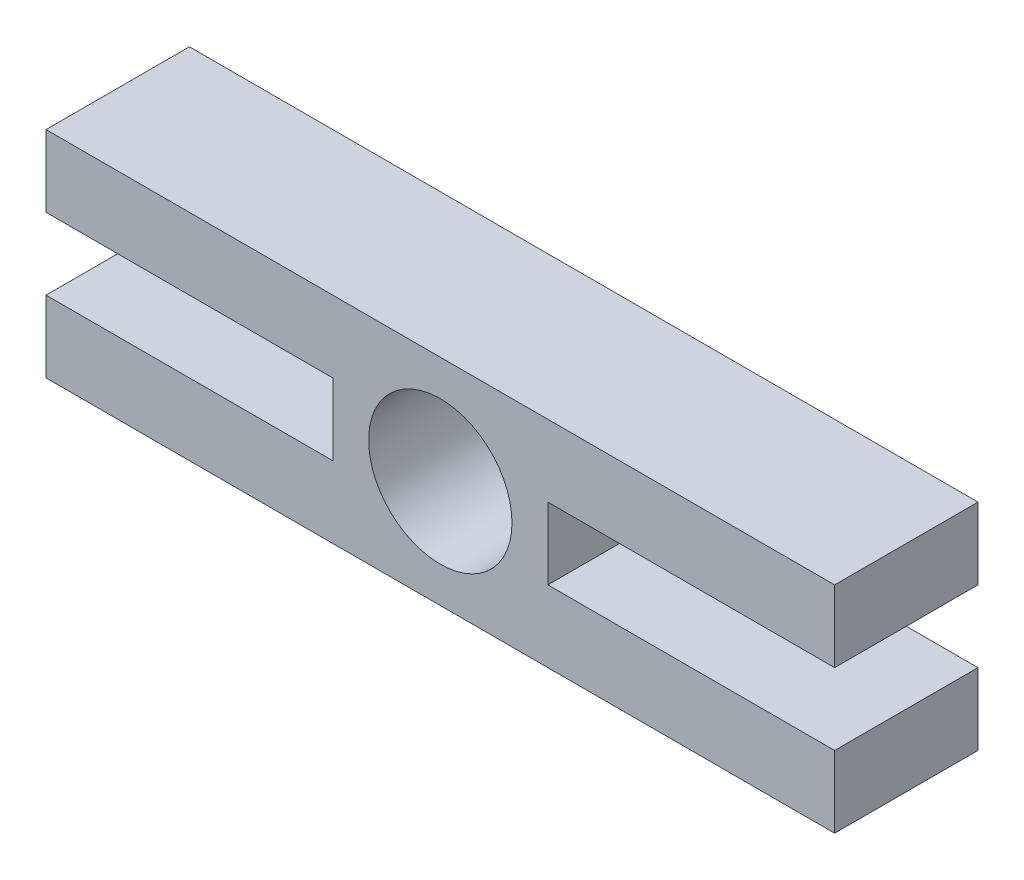
ISO-10303-21;
HEADER;
FILE_DESCRIPTION(('STEP AP214'),'2;1');
FILE_NAME('part.step','',(''),(''),'','','');
FILE_SCHEMA(('AUTOMOTIVE_DESIGN { 1 0 10303 214 1 1 1 1 }'));
ENDSEC;
DATA;
#1=APPLICATION_CONTEXT('core data for automotive mechanical design processes');
#2=APPLICATION_PROTOCOL_DEFINITION('international standard','automotive_design',2000,#1);
#3=PRODUCT_CONTEXT('',#1,'mechanical');
#4=PRODUCT('Part','Part','',(#3));
#5=PRODUCT_RELATED_PRODUCT_CATEGORY('part','',(#4));
#6=PRODUCT_DEFINITION_FORMATION('','',#4);
#7=PRODUCT_DEFINITION_CONTEXT('part definition',#1,'design');
#8=PRODUCT_DEFINITION('design','',#6,#7);
#9=PRODUCT_DEFINITION_SHAPE('','',#8);
#10=(LENGTH_UNIT() NAMED_UNIT(*) SI_UNIT(.MILLI.,.METRE.));
#11=(NAMED_UNIT(*) PLANE_ANGLE_UNIT() SI_UNIT($,.RADIAN.));
#12=(NAMED_UNIT(*) SI_UNIT($,.STERADIAN.) SOLID_ANGLE_UNIT());
#13=UNCERTAINTY_MEASURE_WITH_UNIT(LENGTH_MEASURE(1.E-05),#10,'distance_accuracy_value','');
#14=(GEOMETRIC_REPRESENTATION_CONTEXT(3) GLOBAL_UNCERTAINTY_ASSIGNED_CONTEXT((#13)) GLOBAL_UNIT_ASSIGNED_CONTEXT((#10,
#11,#12)) REPRESENTATION_CONTEXT('',''));
#15=CARTESIAN_POINT('',(0.,0.,0.));
#16=DIRECTION('',(0.,0.,1.));
#17=DIRECTION('',(1.,0.,0.));
#18=AXIS2_PLACEMENT_3D('',#15,#16,#17);
#19=CARTESIAN_POINT('',(0.,0.,25.4));
#20=DIRECTION('',(0.,0.,-1.));
#21=DIRECTION('',(-1.,0.,0.));
#22=AXIS2_PLACEMENT_3D('',#19,#20,#21);
#23=PLANE('',#22);
#24=DIRECTION('',(0.,-1.,0.));
#25=VECTOR('',#24,1.);
#26=CARTESIAN_POINT('',(-50.8,-6.34999999999994,25.4));
#27=LINE('',#26,#25);
#28=CARTESIAN_POINT('',(-50.8,6.34999999999999,25.4));
#29=VERTEX_POINT('',#28);
#30=CARTESIAN_POINT('',(-50.8,-6.34999999999994,25.4));
#31=VERTEX_POINT('',#30);
#32=EDGE_CURVE('E54',#29,#31,#27,.T.);
#33=ORIENTED_EDGE('',*,*,#32,.T.);
#34=DIRECTION('',(1.,0.,0.));
#35=VECTOR('',#34,1.);
#36=CARTESIAN_POINT('',(19.05,-6.35000000000002,25.4));
#37=LINE('',#36,#35);
#38=CARTESIAN_POINT('',(88.9,-6.35000000000009,25.4));
#39=VERTEX_POINT('',#38);
#40=EDGE_CURVE('E110',#31,#39,#37,.T.);
#41=ORIENTED_EDGE('',*,*,#40,.T.);
#42=DIRECTION('',(0.,1.,0.));
#43=VECTOR('',#42,1.);
#44=CARTESIAN_POINT('',(88.9,-6.35000000000009,25.4));
#45=LINE('',#44,#43);
#46=CARTESIAN_POINT('',(88.9,6.35000000000001,25.4));
#47=VERTEX_POINT('',#46);
#48=EDGE_CURVE('E214',#39,#47,#45,.T.);
#49=ORIENTED_EDGE('',*,*,#48,.T.);
#50=DIRECTION('',(-1.,0.,0.));
#51=VECTOR('',#50,1.);
#52=CARTESIAN_POINT('',(88.9,6.35000000000001,25.4));
#53=LINE('',#52,#51);
#54=CARTESIAN_POINT('',(38.1,6.34999999999999,25.4));
#55=VERTEX_POINT('',#54);
#56=EDGE_CURVE('E229',#47,#55,#53,.T.);
#57=ORIENTED_EDGE('',*,*,#56,.T.);
#58=DIRECTION('',(0.,1.,0.));
#59=VECTOR('',#58,1.);
#60=CARTESIAN_POINT('',(38.1,6.34999999999999,25.4));
#61=LINE('',#60,#59);
#62=CARTESIAN_POINT('',(38.1,19.05,25.4));
#63=VERTEX_POINT('',#62);
#64=EDGE_CURVE('E231',#55,#63,#61,.T.);
#65=ORIENTED_EDGE('',*,*,#64,.T.);
#66=DIRECTION('',(1.,0.,0.));
#67=VECTOR('',#66,1.);
#68=CARTESIAN_POINT('',(38.1,19.05,25.4));
#69=LINE('',#68,#67);
#70=CARTESIAN_POINT('',(88.9,19.05,25.4));
#71=VERTEX_POINT('',#70);
#72=EDGE_CURVE('E233',#63,#71,#69,.T.);
#73=ORIENTED_EDGE('',*,*,#72,.T.);
#74=DIRECTION('',(0.,1.,0.));
#75=VECTOR('',#74,1.);
#76=CARTESIAN_POINT('',(88.9,19.05,25.4));
#77=LINE('',#76,#75);
#78=CARTESIAN_POINT('',(88.9,31.75,25.4));
#79=VERTEX_POINT('',#78);
#80=EDGE_CURVE('E235',#71,#79,#77,.T.);
#81=ORIENTED_EDGE('',*,*,#80,.T.);
#82=DIRECTION('',(-1.,0.,0.));
#83=VECTOR('',#82,1.);
#84=CARTESIAN_POINT('',(19.05,31.75,25.4));
#85=LINE('',#84,#83);
#86=CARTESIAN_POINT('',(-50.8,31.75,25.4));
#87=VERTEX_POINT('',#86);
#88=EDGE_CURVE('E237',#79,#87,#85,.T.);
#89=ORIENTED_EDGE('',*,*,#88,.T.);
#90=DIRECTION('',(0.,-1.,0.));
#91=VECTOR('',#90,1.);
#92=CARTESIAN_POINT('',(-50.8,31.75,25.4));
#93=LINE('',#92,#91);
#94=CARTESIAN_POINT('',(-50.8,19.05,25.4));
#95=VERTEX_POINT('',#94);
#96=EDGE_CURVE('E142',#87,#95,#93,.T.);
#97=ORIENTED_EDGE('',*,*,#96,.T.);
#98=DIRECTION('',(1.,0.,0.));
#99=VECTOR('',#98,1.);
#100=CARTESIAN_POINT('',(0.,19.05,25.4));
#101=LINE('',#100,#99);
#102=CARTESIAN_POINT('',(0.,19.05,25.4));
#103=VERTEX_POINT('',#102);
#104=EDGE_CURVE('E136',#95,#103,#101,.T.);
#105=ORIENTED_EDGE('',*,*,#104,.T.);
#106=DIRECTION('',(0.,-1.,0.));
#107=VECTOR('',#106,1.);
#108=CARTESIAN_POINT('',(0.,6.34999999999999,25.4));
#109=LINE('',#108,#107);
#110=CARTESIAN_POINT('',(0.,6.34999999999999,25.4));
#111=VERTEX_POINT('',#110);
#112=EDGE_CURVE('E140',#103,#111,#109,.T.);
#113=ORIENTED_EDGE('',*,*,#112,.T.);
#114=DIRECTION('',(-1.,0.,0.));
#115=VECTOR('',#114,1.);
#116=CARTESIAN_POINT('',(-50.8,6.34999999999999,25.4));
#117=LINE('',#116,#115);
#118=EDGE_CURVE('E156',#111,#29,#117,.T.);
#119=ORIENTED_EDGE('',*,*,#118,.T.);
#120=EDGE_LOOP('',(#33,#41,#49,#57,#65,#73,#81,#89,#97,#105,#113,#119));
#121=FACE_BOUND('',#120,.T.);
#122=CARTESIAN_POINT('',(19.05,12.7,25.4));
#123=DIRECTION('',(0.,0.,1.));
#124=DIRECTION('',(1.,0.,0.));
#125=AXIS2_PLACEMENT_3D('',#122,#123,#124);
#126=CIRCLE('',#125,12.7);
#127=CARTESIAN_POINT('',(31.75,12.7,25.4));
#128=VERTEX_POINT('',#127);
#129=EDGE_CURVE('E166',#128,#128,#126,.T.);
#130=ORIENTED_EDGE('',*,*,#129,.F.);
#131=EDGE_LOOP('',(#130));
#132=FACE_BOUND('',#131,.T.);
#133=ADVANCED_FACE('F37',(#121,#132),#23,.F.);
#134=CARTESIAN_POINT('',(0.,0.,0.));
#135=DIRECTION('',(0.,0.,-1.));
#136=DIRECTION('',(-1.,0.,0.));
#137=AXIS2_PLACEMENT_3D('',#134,#135,#136);
#138=PLANE('',#137);
#139=DIRECTION('',(1.,0.,0.));
#140=VECTOR('',#139,1.);
#141=CARTESIAN_POINT('',(19.05,-6.35000000000002,0.));
#142=LINE('',#141,#140);
#143=CARTESIAN_POINT('',(-50.8,-6.34999999999994,0.));
#144=VERTEX_POINT('',#143);
#145=CARTESIAN_POINT('',(88.9,-6.35000000000009,0.));
#146=VERTEX_POINT('',#145);
#147=EDGE_CURVE('E162',#144,#146,#142,.T.);
#148=ORIENTED_EDGE('',*,*,#147,.F.);
#149=DIRECTION('',(0.,-1.,0.));
#150=VECTOR('',#149,1.);
#151=CARTESIAN_POINT('',(-50.8,0.,0.));
#152=LINE('',#151,#150);
#153=CARTESIAN_POINT('',(-50.8,6.34999999999999,0.));
#154=VERTEX_POINT('',#153);
#155=EDGE_CURVE('E186',#154,#144,#152,.T.);
#156=ORIENTED_EDGE('',*,*,#155,.F.);
#157=DIRECTION('',(-1.,0.,0.));
#158=VECTOR('',#157,1.);
#159=CARTESIAN_POINT('',(-50.8,6.34999999999999,0.));
#160=LINE('',#159,#158);
#161=CARTESIAN_POINT('',(0.,6.34999999999999,0.));
#162=VERTEX_POINT('',#161);
#163=EDGE_CURVE('E103',#162,#154,#160,.T.);
#164=ORIENTED_EDGE('',*,*,#163,.F.);
#165=DIRECTION('',(0.,-1.,0.));
#166=VECTOR('',#165,1.);
#167=CARTESIAN_POINT('',(0.,6.34999999999999,0.));
#168=LINE('',#167,#166);
#169=CARTESIAN_POINT('',(0.,19.05,0.));
#170=VERTEX_POINT('',#169);
#171=EDGE_CURVE('E96',#170,#162,#168,.T.);
#172=ORIENTED_EDGE('',*,*,#171,.F.);
#173=DIRECTION('',(1.,0.,0.));
#174=VECTOR('',#173,1.);
#175=CARTESIAN_POINT('',(0.,19.05,0.));
#176=LINE('',#175,#174);
#177=CARTESIAN_POINT('',(-50.8,19.05,0.));
#178=VERTEX_POINT('',#177);
#179=EDGE_CURVE('E150',#178,#170,#176,.T.);
#180=ORIENTED_EDGE('',*,*,#179,.F.);
#181=DIRECTION('',(0.,-1.,0.));
#182=VECTOR('',#181,1.);
#183=CARTESIAN_POINT('',(-50.8,19.05,0.));
#184=LINE('',#183,#182);
#185=CARTESIAN_POINT('',(-50.8,31.75,0.));
#186=VERTEX_POINT('',#185);
#187=EDGE_CURVE('E181',#186,#178,#184,.T.);
#188=ORIENTED_EDGE('',*,*,#187,.F.);
#189=DIRECTION('',(-1.,0.,0.));
#190=VECTOR('',#189,1.);
#191=CARTESIAN_POINT('',(19.05,31.75,0.));
#192=LINE('',#191,#190);
#193=CARTESIAN_POINT('',(88.9,31.75,0.));
#194=VERTEX_POINT('',#193);
#195=EDGE_CURVE('E178',#194,#186,#192,.T.);
#196=ORIENTED_EDGE('',*,*,#195,.F.);
#197=DIRECTION('',(0.,1.,0.));
#198=VECTOR('',#197,1.);
#199=CARTESIAN_POINT('',(88.9,31.75,0.));
#200=LINE('',#199,#198);
#201=CARTESIAN_POINT('',(88.9,19.05,0.));
#202=VERTEX_POINT('',#201);
#203=EDGE_CURVE('E175',#202,#194,#200,.T.);
#204=ORIENTED_EDGE('',*,*,#203,.F.);
#205=DIRECTION('',(1.,0.,0.));
#206=VECTOR('',#205,1.);
#207=CARTESIAN_POINT('',(38.1,19.05,0.));
#208=LINE('',#207,#206);
#209=CARTESIAN_POINT('',(38.1,19.05,0.));
#210=VERTEX_POINT('',#209);
#211=EDGE_CURVE('E172',#210,#202,#208,.T.);
#212=ORIENTED_EDGE('',*,*,#211,.F.);
#213=DIRECTION('',(0.,1.,0.));
#214=VECTOR('',#213,1.);
#215=CARTESIAN_POINT('',(38.1,6.34999999999999,0.));
#216=LINE('',#215,#214);
#217=CARTESIAN_POINT('',(38.1,6.34999999999999,0.));
#218=VERTEX_POINT('',#217);
#219=EDGE_CURVE('E170',#218,#210,#216,.T.);
#220=ORIENTED_EDGE('',*,*,#219,.F.);
#221=DIRECTION('',(-1.,0.,0.));
#222=VECTOR('',#221,1.);
#223=CARTESIAN_POINT('',(88.9,6.35000000000001,0.));
#224=LINE('',#223,#222);
#225=CARTESIAN_POINT('',(88.9,6.35000000000001,0.));
#226=VERTEX_POINT('',#225);
#227=EDGE_CURVE('E168',#226,#218,#224,.T.);
#228=ORIENTED_EDGE('',*,*,#227,.F.);
#229=DIRECTION('',(0.,1.,0.));
#230=VECTOR('',#229,1.);
#231=CARTESIAN_POINT('',(88.9,0.,0.));
#232=LINE('',#231,#230);
#233=EDGE_CURVE('E165',#146,#226,#232,.T.);
#234=ORIENTED_EDGE('',*,*,#233,.F.);
#235=EDGE_LOOP('',(#148,#156,#164,#172,#180,#188,#196,#204,#212,#220,#228,#234));
#236=FACE_BOUND('',#235,.T.);
#237=CARTESIAN_POINT('',(19.05,12.7,0.));
#238=DIRECTION('',(0.,0.,1.));
#239=DIRECTION('',(1.,0.,0.));
#240=AXIS2_PLACEMENT_3D('',#237,#238,#239);
#241=CIRCLE('',#240,12.7);
#242=CARTESIAN_POINT('',(31.75,12.7,0.));
#243=VERTEX_POINT('',#242);
#244=EDGE_CURVE('E225',#243,#243,#241,.T.);
#245=ORIENTED_EDGE('',*,*,#244,.T.);
#246=EDGE_LOOP('',(#245));
#247=FACE_BOUND('',#246,.T.);
#248=ADVANCED_FACE('F217',(#236,#247),#138,.T.);
#249=CARTESIAN_POINT('',(19.05,-6.35000000000002,25.4));
#250=DIRECTION('',(0.,1.,0.));
#251=DIRECTION('',(-1.,0.,0.));
#252=AXIS2_PLACEMENT_3D('',#249,#250,#251);
#253=PLANE('',#252);
#254=ORIENTED_EDGE('',*,*,#147,.T.);
#255=DIRECTION('',(0.,0.,-1.));
#256=VECTOR('',#255,1.);
#257=CARTESIAN_POINT('',(88.9,-6.35000000000009,25.4));
#258=LINE('',#257,#256);
#259=EDGE_CURVE('E46',#39,#146,#258,.T.);
#260=ORIENTED_EDGE('',*,*,#259,.F.);
#261=ORIENTED_EDGE('',*,*,#40,.F.);
#262=DIRECTION('',(0.,0.,-1.));
#263=VECTOR('',#262,1.);
#264=CARTESIAN_POINT('',(-50.8,-6.34999999999994,25.4));
#265=LINE('',#264,#263);
#266=EDGE_CURVE('E11',#31,#144,#265,.T.);
#267=ORIENTED_EDGE('',*,*,#266,.T.);
#268=EDGE_LOOP('',(#254,#260,#261,#267));
#269=FACE_BOUND('',#268,.T.);
#270=ADVANCED_FACE('F39',(#269),#253,.F.);
#271=CARTESIAN_POINT('',(88.9,0.,25.4));
#272=DIRECTION('',(-1.,0.,0.));
#273=DIRECTION('',(0.,0.,1.));
#274=AXIS2_PLACEMENT_3D('',#271,#272,#273);
#275=PLANE('',#274);
#276=ORIENTED_EDGE('',*,*,#233,.T.);
#277=DIRECTION('',(0.,0.,-1.));
#278=VECTOR('',#277,1.);
#279=CARTESIAN_POINT('',(88.9,6.35000000000001,25.4));
#280=LINE('',#279,#278);
#281=EDGE_CURVE('E207',#47,#226,#280,.T.);
#282=ORIENTED_EDGE('',*,*,#281,.F.);
#283=ORIENTED_EDGE('',*,*,#48,.F.);
#284=ORIENTED_EDGE('',*,*,#259,.T.);
#285=EDGE_LOOP('',(#276,#282,#283,#284));
#286=FACE_BOUND('',#285,.T.);
#287=ADVANCED_FACE('F212',(#286),#275,.F.);
#288=CARTESIAN_POINT('',(88.9,6.35000000000001,25.4));
#289=DIRECTION('',(0.,-1.,0.));
#290=DIRECTION('',(1.,0.,0.));
#291=AXIS2_PLACEMENT_3D('',#288,#289,#290);
#292=PLANE('',#291);
#293=ORIENTED_EDGE('',*,*,#227,.T.);
#294=DIRECTION('',(0.,0.,-1.));
#295=VECTOR('',#294,1.);
#296=CARTESIAN_POINT('',(38.1,6.34999999999999,25.4));
#297=LINE('',#296,#295);
#298=EDGE_CURVE('E204',#55,#218,#297,.T.);
#299=ORIENTED_EDGE('',*,*,#298,.F.);
#300=ORIENTED_EDGE('',*,*,#56,.F.);
#301=ORIENTED_EDGE('',*,*,#281,.T.);
#302=EDGE_LOOP('',(#293,#299,#300,#301));
#303=FACE_BOUND('',#302,.T.);
#304=ADVANCED_FACE('F261',(#303),#292,.F.);
#305=CARTESIAN_POINT('',(38.1,6.34999999999999,25.4));
#306=DIRECTION('',(-1.,0.,0.));
#307=DIRECTION('',(0.,0.,1.));
#308=AXIS2_PLACEMENT_3D('',#305,#306,#307);
#309=PLANE('',#308);
#310=ORIENTED_EDGE('',*,*,#219,.T.);
#311=DIRECTION('',(0.,0.,-1.));
#312=VECTOR('',#311,1.);
#313=CARTESIAN_POINT('',(38.1,19.05,25.4));
#314=LINE('',#313,#312);
#315=EDGE_CURVE('E201',#63,#210,#314,.T.);
#316=ORIENTED_EDGE('',*,*,#315,.F.);
#317=ORIENTED_EDGE('',*,*,#64,.F.);
#318=ORIENTED_EDGE('',*,*,#298,.T.);
#319=EDGE_LOOP('',(#310,#316,#317,#318));
#320=FACE_BOUND('',#319,.T.);
#321=ADVANCED_FACE('F256',(#320),#309,.F.);
#322=CARTESIAN_POINT('',(38.1,19.05,25.4));
#323=DIRECTION('',(0.,1.,0.));
#324=DIRECTION('',(-1.,0.,0.));
#325=AXIS2_PLACEMENT_3D('',#322,#323,#324);
#326=PLANE('',#325);
#327=ORIENTED_EDGE('',*,*,#211,.T.);
#328=DIRECTION('',(0.,0.,-1.));
#329=VECTOR('',#328,1.);
#330=CARTESIAN_POINT('',(88.9,19.05,25.4));
#331=LINE('',#330,#329);
#332=EDGE_CURVE('E198',#71,#202,#331,.T.);
#333=ORIENTED_EDGE('',*,*,#332,.F.);
#334=ORIENTED_EDGE('',*,*,#72,.F.);
#335=ORIENTED_EDGE('',*,*,#315,.T.);
#336=EDGE_LOOP('',(#327,#333,#334,#335));
#337=FACE_BOUND('',#336,.T.);
#338=ADVANCED_FACE('F252',(#337),#326,.F.);
#339=CARTESIAN_POINT('',(88.9,31.75,25.4));
#340=DIRECTION('',(-1.,0.,0.));
#341=DIRECTION('',(0.,0.,1.));
#342=AXIS2_PLACEMENT_3D('',#339,#340,#341);
#343=PLANE('',#342);
#344=ORIENTED_EDGE('',*,*,#203,.T.);
#345=DIRECTION('',(0.,0.,-1.));
#346=VECTOR('',#345,1.);
#347=CARTESIAN_POINT('',(88.9,31.75,25.4));
#348=LINE('',#347,#346);
#349=EDGE_CURVE('E195',#79,#194,#348,.T.);
#350=ORIENTED_EDGE('',*,*,#349,.F.);
#351=ORIENTED_EDGE('',*,*,#80,.F.);
#352=ORIENTED_EDGE('',*,*,#332,.T.);
#353=EDGE_LOOP('',(#344,#350,#351,#352));
#354=FACE_BOUND('',#353,.T.);
#355=ADVANCED_FACE('F248',(#354),#343,.F.);
#356=CARTESIAN_POINT('',(19.05,31.75,25.4));
#357=DIRECTION('',(0.,-1.,0.));
#358=DIRECTION('',(0.,0.,-1.));
#359=AXIS2_PLACEMENT_3D('',#356,#357,#358);
#360=PLANE('',#359);
#361=ORIENTED_EDGE('',*,*,#195,.T.);
#362=DIRECTION('',(0.,0.,-1.));
#363=VECTOR('',#362,1.);
#364=CARTESIAN_POINT('',(-50.8,31.75,25.4));
#365=LINE('',#364,#363);
#366=EDGE_CURVE('E192',#87,#186,#365,.T.);
#367=ORIENTED_EDGE('',*,*,#366,.F.);
#368=ORIENTED_EDGE('',*,*,#88,.F.);
#369=ORIENTED_EDGE('',*,*,#349,.T.);
#370=EDGE_LOOP('',(#361,#367,#368,#369));
#371=FACE_BOUND('',#370,.T.);
#372=ADVANCED_FACE('F243',(#371),#360,.F.);
#373=CARTESIAN_POINT('',(-50.8,19.05,25.4));
#374=DIRECTION('',(1.,0.,0.));
#375=DIRECTION('',(0.,0.,-1.));
#376=AXIS2_PLACEMENT_3D('',#373,#374,#375);
#377=PLANE('',#376);
#378=ORIENTED_EDGE('',*,*,#187,.T.);
#379=DIRECTION('',(0.,0.,-1.));
#380=VECTOR('',#379,1.);
#381=CARTESIAN_POINT('',(-50.8,19.05,25.4));
#382=LINE('',#381,#380);
#383=EDGE_CURVE('E151',#95,#178,#382,.T.);
#384=ORIENTED_EDGE('',*,*,#383,.F.);
#385=ORIENTED_EDGE('',*,*,#96,.F.);
#386=ORIENTED_EDGE('',*,*,#366,.T.);
#387=EDGE_LOOP('',(#378,#384,#385,#386));
#388=FACE_BOUND('',#387,.T.);
#389=ADVANCED_FACE('F245',(#388),#377,.F.);
#390=CARTESIAN_POINT('',(0.,19.05,25.4));
#391=DIRECTION('',(0.,1.,0.));
#392=DIRECTION('',(0.,0.,1.));
#393=AXIS2_PLACEMENT_3D('',#390,#391,#392);
#394=PLANE('',#393);
#395=ORIENTED_EDGE('',*,*,#179,.T.);
#396=DIRECTION('',(0.,0.,-1.));
#397=VECTOR('',#396,1.);
#398=CARTESIAN_POINT('',(0.,19.05,25.4));
#399=LINE('',#398,#397);
#400=EDGE_CURVE('E147',#103,#170,#399,.T.);
#401=ORIENTED_EDGE('',*,*,#400,.F.);
#402=ORIENTED_EDGE('',*,*,#104,.F.);
#403=ORIENTED_EDGE('',*,*,#383,.T.);
#404=EDGE_LOOP('',(#395,#401,#402,#403));
#405=FACE_BOUND('',#404,.T.);
#406=ADVANCED_FACE('F148',(#405),#394,.F.);
#407=CARTESIAN_POINT('',(0.,6.34999999999999,25.4));
#408=DIRECTION('',(1.,0.,0.));
#409=DIRECTION('',(0.,0.,-1.));
#410=AXIS2_PLACEMENT_3D('',#407,#408,#409);
#411=PLANE('',#410);
#412=ORIENTED_EDGE('',*,*,#171,.T.);
#413=DIRECTION('',(0.,0.,-1.));
#414=VECTOR('',#413,1.);
#415=CARTESIAN_POINT('',(0.,6.34999999999999,25.4));
#416=LINE('',#415,#414);
#417=EDGE_CURVE('E152',#111,#162,#416,.T.);
#418=ORIENTED_EDGE('',*,*,#417,.F.);
#419=ORIENTED_EDGE('',*,*,#112,.F.);
#420=ORIENTED_EDGE('',*,*,#400,.T.);
#421=EDGE_LOOP('',(#412,#418,#419,#420));
#422=FACE_BOUND('',#421,.T.);
#423=ADVANCED_FACE('F154',(#422),#411,.F.);
#424=CARTESIAN_POINT('',(-50.8,6.34999999999999,25.4));
#425=DIRECTION('',(0.,-1.,0.));
#426=DIRECTION('',(0.,0.,-1.));
#427=AXIS2_PLACEMENT_3D('',#424,#425,#426);
#428=PLANE('',#427);
#429=ORIENTED_EDGE('',*,*,#163,.T.);
#430=DIRECTION('',(0.,0.,-1.));
#431=VECTOR('',#430,1.);
#432=CARTESIAN_POINT('',(-50.8,6.34999999999999,25.4));
#433=LINE('',#432,#431);
#434=EDGE_CURVE('E158',#29,#154,#433,.T.);
#435=ORIENTED_EDGE('',*,*,#434,.F.);
#436=ORIENTED_EDGE('',*,*,#118,.F.);
#437=ORIENTED_EDGE('',*,*,#417,.T.);
#438=EDGE_LOOP('',(#429,#435,#436,#437));
#439=FACE_BOUND('',#438,.T.);
#440=ADVANCED_FACE('F221',(#439),#428,.F.);
#441=CARTESIAN_POINT('',(-50.8,0.,25.4));
#442=DIRECTION('',(1.,0.,0.));
#443=DIRECTION('',(0.,0.,-1.));
#444=AXIS2_PLACEMENT_3D('',#441,#442,#443);
#445=PLANE('',#444);
#446=ORIENTED_EDGE('',*,*,#155,.T.);
#447=ORIENTED_EDGE('',*,*,#266,.F.);
#448=ORIENTED_EDGE('',*,*,#32,.F.);
#449=ORIENTED_EDGE('',*,*,#434,.T.);
#450=EDGE_LOOP('',(#446,#447,#448,#449));
#451=FACE_BOUND('',#450,.T.);
#452=ADVANCED_FACE('F220',(#451),#445,.F.);
#453=CARTESIAN_POINT('',(19.05,12.7,25.4));
#454=DIRECTION('',(0.,0.,-1.));
#455=DIRECTION('',(-1.,0.,0.));
#456=AXIS2_PLACEMENT_3D('',#453,#454,#455);
#457=CYLINDRICAL_SURFACE('',#456,12.7);
#458=ORIENTED_EDGE('',*,*,#129,.T.);
#459=EDGE_LOOP('',(#458));
#460=FACE_BOUND('',#459,.T.);
#461=ORIENTED_EDGE('',*,*,#244,.F.);
#462=EDGE_LOOP('',(#461));
#463=FACE_BOUND('',#462,.T.);
#464=ADVANCED_FACE('F276',(#460,#463),#457,.F.);
#465=CLOSED_SHELL('',(#133,#248,#270,#287,#304,#321,#338,#355,#372,#389,#406,#423,#440,#452,#464));
#466=MANIFOLD_SOLID_BREP('B2',#465);
#467=ADVANCED_BREP_SHAPE_REPRESENTATION('',(#18,#466),#14);
#468=SHAPE_DEFINITION_REPRESENTATION(#9,#467);
ENDSEC;
END-ISO-10303-21;
